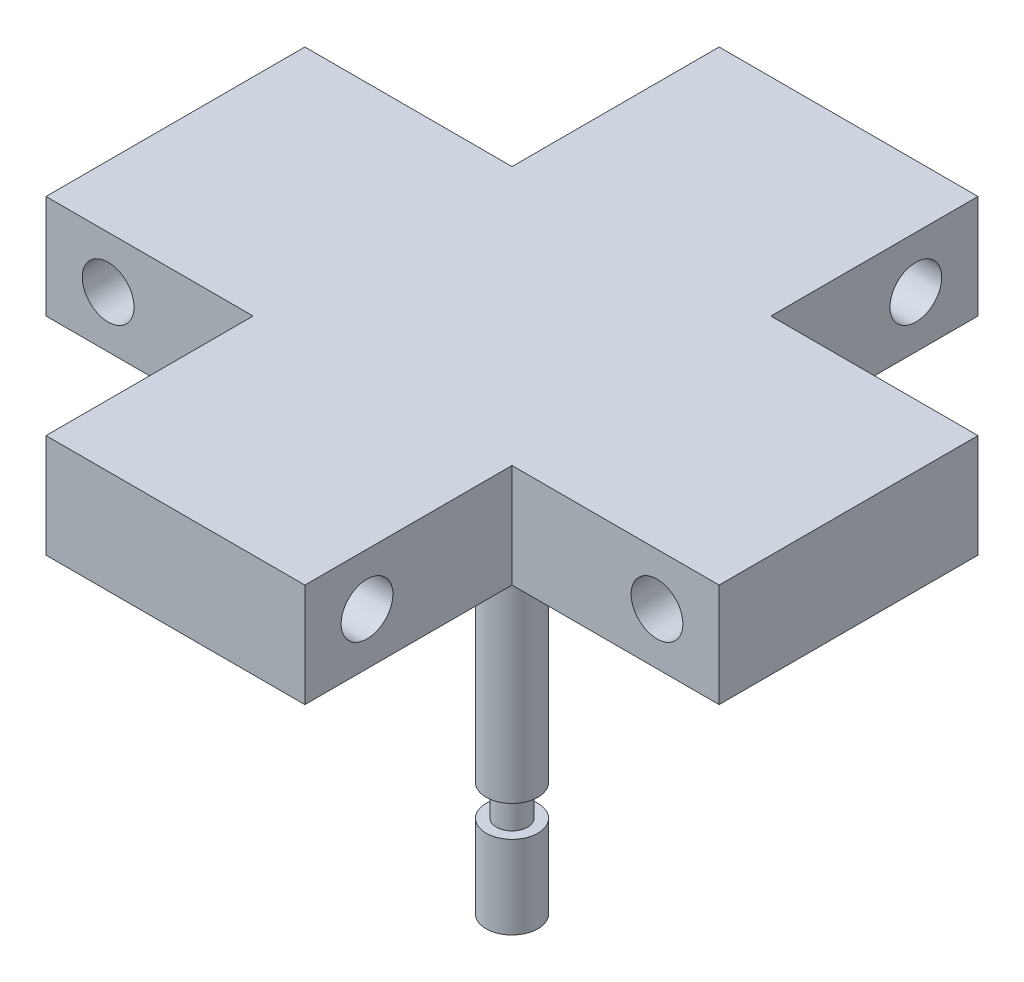
ISO-10303-21;
HEADER;
FILE_DESCRIPTION(('STEP AP214'),'2;1');
FILE_NAME('part.step','',(''),(''),'','','');
FILE_SCHEMA(('AUTOMOTIVE_DESIGN { 1 0 10303 214 1 1 1 1 }'));
ENDSEC;
DATA;
#1=APPLICATION_CONTEXT('core data for automotive mechanical design processes');
#2=APPLICATION_PROTOCOL_DEFINITION('international standard','automotive_design',2000,#1);
#3=PRODUCT_CONTEXT('',#1,'mechanical');
#4=PRODUCT('Part','Part','',(#3));
#5=PRODUCT_RELATED_PRODUCT_CATEGORY('part','',(#4));
#6=PRODUCT_DEFINITION_FORMATION('','',#4);
#7=PRODUCT_DEFINITION_CONTEXT('part definition',#1,'design');
#8=PRODUCT_DEFINITION('design','',#6,#7);
#9=PRODUCT_DEFINITION_SHAPE('','',#8);
#10=(LENGTH_UNIT() NAMED_UNIT(*) SI_UNIT(.MILLI.,.METRE.));
#11=(NAMED_UNIT(*) PLANE_ANGLE_UNIT() SI_UNIT($,.RADIAN.));
#12=(NAMED_UNIT(*) SI_UNIT($,.STERADIAN.) SOLID_ANGLE_UNIT());
#13=UNCERTAINTY_MEASURE_WITH_UNIT(LENGTH_MEASURE(1.E-05),#10,'distance_accuracy_value','');
#14=(GEOMETRIC_REPRESENTATION_CONTEXT(3) GLOBAL_UNCERTAINTY_ASSIGNED_CONTEXT((#13)) GLOBAL_UNIT_ASSIGNED_CONTEXT((#10,
#11,#12)) REPRESENTATION_CONTEXT('',''));
#15=CARTESIAN_POINT('',(0.,0.,0.));
#16=DIRECTION('',(0.,0.,1.));
#17=DIRECTION('',(1.,0.,0.));
#18=AXIS2_PLACEMENT_3D('',#15,#16,#17);
#19=CARTESIAN_POINT('',(0.,-40.,0.));
#20=DIRECTION('',(0.,1.,0.));
#21=DIRECTION('',(0.,0.,1.));
#22=AXIS2_PLACEMENT_3D('',#19,#20,#21);
#23=CYLINDRICAL_SURFACE('',#22,2.5);
#24=CARTESIAN_POINT('',(0.,0.,0.));
#25=DIRECTION('',(0.,1.,0.));
#26=DIRECTION('',(0.,0.,1.));
#27=AXIS2_PLACEMENT_3D('',#24,#25,#26);
#28=CIRCLE('',#27,2.5);
#29=CARTESIAN_POINT('',(0.,0.,2.5));
#30=VERTEX_POINT('',#29);
#31=EDGE_CURVE('E301',#30,#30,#28,.T.);
#32=ORIENTED_EDGE('',*,*,#31,.F.);
#33=EDGE_LOOP('',(#32));
#34=FACE_BOUND('',#33,.T.);
#35=CARTESIAN_POINT('',(0.,-29.,0.));
#36=DIRECTION('',(0.,1.,0.));
#37=DIRECTION('',(0.,0.,1.));
#38=AXIS2_PLACEMENT_3D('',#35,#36,#37);
#39=CIRCLE('',#38,2.5);
#40=CARTESIAN_POINT('',(0.,-29.,2.5));
#41=VERTEX_POINT('',#40);
#42=EDGE_CURVE('E298',#41,#41,#39,.T.);
#43=ORIENTED_EDGE('',*,*,#42,.T.);
#44=EDGE_LOOP('',(#43));
#45=FACE_BOUND('',#44,.T.);
#46=ADVANCED_FACE('F35',(#34,#45),#23,.T.);
#47=CARTESIAN_POINT('',(0.,10.,-12.5));
#48=DIRECTION('',(0.,0.,1.));
#49=DIRECTION('',(1.,0.,0.));
#50=AXIS2_PLACEMENT_3D('',#47,#48,#49);
#51=PLANE('',#50);
#52=CARTESIAN_POINT('',(-26.5000000000001,4.99999999999999,-12.5));
#53=DIRECTION('',(0.,0.,1.));
#54=DIRECTION('',(1.,0.,0.));
#55=AXIS2_PLACEMENT_3D('',#52,#53,#54);
#56=CIRCLE('',#55,2.49999999999999);
#57=CARTESIAN_POINT('',(-24.0000000000001,4.99999999999999,-12.5));
#58=VERTEX_POINT('',#57);
#59=EDGE_CURVE('E307',#58,#58,#56,.T.);
#60=ORIENTED_EDGE('',*,*,#59,.T.);
#61=EDGE_LOOP('',(#60));
#62=FACE_BOUND('',#61,.T.);
#63=DIRECTION('',(-1.,0.,0.));
#64=VECTOR('',#63,1.);
#65=CARTESIAN_POINT('',(0.,0.,-12.5));
#66=LINE('',#65,#64);
#67=CARTESIAN_POINT('',(-12.5,0.,-12.5));
#68=VERTEX_POINT('',#67);
#69=CARTESIAN_POINT('',(-32.5,0.,-12.5));
#70=VERTEX_POINT('',#69);
#71=EDGE_CURVE('E159',#68,#70,#66,.T.);
#72=ORIENTED_EDGE('',*,*,#71,.T.);
#73=DIRECTION('',(0.,-1.,0.));
#74=VECTOR('',#73,1.);
#75=CARTESIAN_POINT('',(-32.5,10.,-12.5));
#76=LINE('',#75,#74);
#77=CARTESIAN_POINT('',(-32.5,10.,-12.5));
#78=VERTEX_POINT('',#77);
#79=EDGE_CURVE('E11',#78,#70,#76,.T.);
#80=ORIENTED_EDGE('',*,*,#79,.F.);
#81=DIRECTION('',(-1.,0.,0.));
#82=VECTOR('',#81,1.);
#83=CARTESIAN_POINT('',(0.,10.,-12.5));
#84=LINE('',#83,#82);
#85=CARTESIAN_POINT('',(-12.5,10.,-12.5));
#86=VERTEX_POINT('',#85);
#87=EDGE_CURVE('E192',#86,#78,#84,.T.);
#88=ORIENTED_EDGE('',*,*,#87,.F.);
#89=DIRECTION('',(0.,-1.,0.));
#90=VECTOR('',#89,1.);
#91=CARTESIAN_POINT('',(-12.5,10.,-12.5));
#92=LINE('',#91,#90);
#93=EDGE_CURVE('E54',#86,#68,#92,.T.);
#94=ORIENTED_EDGE('',*,*,#93,.T.);
#95=EDGE_LOOP('',(#72,#80,#88,#94));
#96=FACE_BOUND('',#95,.T.);
#97=ADVANCED_FACE('F37',(#62,#96),#51,.F.);
#98=CARTESIAN_POINT('',(-32.5,10.,0.));
#99=DIRECTION('',(1.,0.,0.));
#100=DIRECTION('',(0.,0.,-1.));
#101=AXIS2_PLACEMENT_3D('',#98,#99,#100);
#102=PLANE('',#101);
#103=DIRECTION('',(0.,0.,1.));
#104=VECTOR('',#103,1.);
#105=CARTESIAN_POINT('',(-32.5,0.,0.));
#106=LINE('',#105,#104);
#107=CARTESIAN_POINT('',(-32.5,0.,12.5));
#108=VERTEX_POINT('',#107);
#109=EDGE_CURVE('E161',#70,#108,#106,.T.);
#110=ORIENTED_EDGE('',*,*,#109,.T.);
#111=DIRECTION('',(0.,-1.,0.));
#112=VECTOR('',#111,1.);
#113=CARTESIAN_POINT('',(-32.5,10.,12.5));
#114=LINE('',#113,#112);
#115=CARTESIAN_POINT('',(-32.5,10.,12.5));
#116=VERTEX_POINT('',#115);
#117=EDGE_CURVE('E45',#116,#108,#114,.T.);
#118=ORIENTED_EDGE('',*,*,#117,.F.);
#119=DIRECTION('',(0.,0.,1.));
#120=VECTOR('',#119,1.);
#121=CARTESIAN_POINT('',(-32.5,10.,0.));
#122=LINE('',#121,#120);
#123=EDGE_CURVE('E104',#78,#116,#122,.T.);
#124=ORIENTED_EDGE('',*,*,#123,.F.);
#125=ORIENTED_EDGE('',*,*,#79,.T.);
#126=EDGE_LOOP('',(#110,#118,#124,#125));
#127=FACE_BOUND('',#126,.T.);
#128=ADVANCED_FACE('F268',(#127),#102,.F.);
#129=CARTESIAN_POINT('',(0.,10.,12.5));
#130=DIRECTION('',(0.,0.,1.));
#131=DIRECTION('',(1.,0.,0.));
#132=AXIS2_PLACEMENT_3D('',#129,#130,#131);
#133=PLANE('',#132);
#134=CARTESIAN_POINT('',(-26.5000000000001,4.99999999999999,12.5));
#135=DIRECTION('',(0.,0.,1.));
#136=DIRECTION('',(1.,0.,0.));
#137=AXIS2_PLACEMENT_3D('',#134,#135,#136);
#138=CIRCLE('',#137,2.49999999999999);
#139=CARTESIAN_POINT('',(-24.0000000000001,4.99999999999999,12.5));
#140=VERTEX_POINT('',#139);
#141=EDGE_CURVE('E303',#140,#140,#138,.T.);
#142=ORIENTED_EDGE('',*,*,#141,.F.);
#143=EDGE_LOOP('',(#142));
#144=FACE_BOUND('',#143,.T.);
#145=DIRECTION('',(-1.,0.,0.));
#146=VECTOR('',#145,1.);
#147=CARTESIAN_POINT('',(0.,0.,12.5));
#148=LINE('',#147,#146);
#149=CARTESIAN_POINT('',(-12.5,0.,12.5));
#150=VERTEX_POINT('',#149);
#151=EDGE_CURVE('E165',#150,#108,#148,.T.);
#152=ORIENTED_EDGE('',*,*,#151,.F.);
#153=DIRECTION('',(0.,-1.,0.));
#154=VECTOR('',#153,1.);
#155=CARTESIAN_POINT('',(-12.5,10.,12.5));
#156=LINE('',#155,#154);
#157=CARTESIAN_POINT('',(-12.5,10.,12.5));
#158=VERTEX_POINT('',#157);
#159=EDGE_CURVE('E206',#158,#150,#156,.T.);
#160=ORIENTED_EDGE('',*,*,#159,.F.);
#161=DIRECTION('',(-1.,0.,0.));
#162=VECTOR('',#161,1.);
#163=CARTESIAN_POINT('',(0.,10.,12.5));
#164=LINE('',#163,#162);
#165=EDGE_CURVE('E229',#158,#116,#164,.T.);
#166=ORIENTED_EDGE('',*,*,#165,.T.);
#167=ORIENTED_EDGE('',*,*,#117,.T.);
#168=EDGE_LOOP('',(#152,#160,#166,#167));
#169=FACE_BOUND('',#168,.T.);
#170=ADVANCED_FACE('F340',(#144,#169),#133,.T.);
#171=CARTESIAN_POINT('',(-12.5,10.,0.));
#172=DIRECTION('',(1.,0.,0.));
#173=DIRECTION('',(0.,0.,-1.));
#174=AXIS2_PLACEMENT_3D('',#171,#172,#173);
#175=PLANE('',#174);
#176=CARTESIAN_POINT('',(-12.5,4.99999999995049,26.4999999987264));
#177=DIRECTION('',(1.,0.,0.));
#178=DIRECTION('',(0.,0.,-1.));
#179=AXIS2_PLACEMENT_3D('',#176,#177,#178);
#180=CIRCLE('',#179,2.5);
#181=CARTESIAN_POINT('',(-12.5,4.99999999995049,23.9999999987264));
#182=VERTEX_POINT('',#181);
#183=EDGE_CURVE('E162',#182,#182,#180,.T.);
#184=ORIENTED_EDGE('',*,*,#183,.T.);
#185=EDGE_LOOP('',(#184));
#186=FACE_BOUND('',#185,.T.);
#187=DIRECTION('',(0.,0.,1.));
#188=VECTOR('',#187,1.);
#189=CARTESIAN_POINT('',(-12.5,0.,0.));
#190=LINE('',#189,#188);
#191=CARTESIAN_POINT('',(-12.5,0.,32.5));
#192=VERTEX_POINT('',#191);
#193=EDGE_CURVE('E168',#150,#192,#190,.T.);
#194=ORIENTED_EDGE('',*,*,#193,.T.);
#195=DIRECTION('',(0.,-1.,0.));
#196=VECTOR('',#195,1.);
#197=CARTESIAN_POINT('',(-12.5,10.,32.5));
#198=LINE('',#197,#196);
#199=CARTESIAN_POINT('',(-12.5,10.,32.5));
#200=VERTEX_POINT('',#199);
#201=EDGE_CURVE('E204',#200,#192,#198,.T.);
#202=ORIENTED_EDGE('',*,*,#201,.F.);
#203=DIRECTION('',(0.,0.,1.));
#204=VECTOR('',#203,1.);
#205=CARTESIAN_POINT('',(-12.5,10.,0.));
#206=LINE('',#205,#204);
#207=EDGE_CURVE('E232',#158,#200,#206,.T.);
#208=ORIENTED_EDGE('',*,*,#207,.F.);
#209=ORIENTED_EDGE('',*,*,#159,.T.);
#210=EDGE_LOOP('',(#194,#202,#208,#209));
#211=FACE_BOUND('',#210,.T.);
#212=ADVANCED_FACE('F337',(#186,#211),#175,.F.);
#213=CARTESIAN_POINT('',(0.,10.,32.5));
#214=DIRECTION('',(0.,0.,1.));
#215=DIRECTION('',(1.,0.,0.));
#216=AXIS2_PLACEMENT_3D('',#213,#214,#215);
#217=PLANE('',#216);
#218=DIRECTION('',(-1.,0.,0.));
#219=VECTOR('',#218,1.);
#220=CARTESIAN_POINT('',(0.,0.,32.5));
#221=LINE('',#220,#219);
#222=CARTESIAN_POINT('',(12.5,0.,32.5));
#223=VERTEX_POINT('',#222);
#224=EDGE_CURVE('E171',#223,#192,#221,.T.);
#225=ORIENTED_EDGE('',*,*,#224,.F.);
#226=DIRECTION('',(0.,-1.,0.));
#227=VECTOR('',#226,1.);
#228=CARTESIAN_POINT('',(12.5,10.,32.5));
#229=LINE('',#228,#227);
#230=CARTESIAN_POINT('',(12.5,10.,32.5));
#231=VERTEX_POINT('',#230);
#232=EDGE_CURVE('E202',#231,#223,#229,.T.);
#233=ORIENTED_EDGE('',*,*,#232,.F.);
#234=DIRECTION('',(-1.,0.,0.));
#235=VECTOR('',#234,1.);
#236=CARTESIAN_POINT('',(0.,10.,32.5));
#237=LINE('',#236,#235);
#238=EDGE_CURVE('E234',#231,#200,#237,.T.);
#239=ORIENTED_EDGE('',*,*,#238,.T.);
#240=ORIENTED_EDGE('',*,*,#201,.T.);
#241=EDGE_LOOP('',(#225,#233,#239,#240));
#242=FACE_BOUND('',#241,.T.);
#243=ADVANCED_FACE('F333',(#242),#217,.T.);
#244=CARTESIAN_POINT('',(12.5,10.,0.));
#245=DIRECTION('',(1.,0.,0.));
#246=DIRECTION('',(0.,0.,-1.));
#247=AXIS2_PLACEMENT_3D('',#244,#245,#246);
#248=PLANE('',#247);
#249=CARTESIAN_POINT('',(12.5,4.99999999995049,26.4999999987264));
#250=DIRECTION('',(1.,0.,0.));
#251=DIRECTION('',(0.,0.,-1.));
#252=AXIS2_PLACEMENT_3D('',#249,#250,#251);
#253=CIRCLE('',#252,2.5);
#254=CARTESIAN_POINT('',(12.5,4.99999999995049,23.9999999987264));
#255=VERTEX_POINT('',#254);
#256=EDGE_CURVE('E210',#255,#255,#253,.T.);
#257=ORIENTED_EDGE('',*,*,#256,.F.);
#258=EDGE_LOOP('',(#257));
#259=FACE_BOUND('',#258,.T.);
#260=DIRECTION('',(0.,0.,1.));
#261=VECTOR('',#260,1.);
#262=CARTESIAN_POINT('',(12.5,0.,0.));
#263=LINE('',#262,#261);
#264=CARTESIAN_POINT('',(12.5,0.,12.5));
#265=VERTEX_POINT('',#264);
#266=EDGE_CURVE('E174',#265,#223,#263,.T.);
#267=ORIENTED_EDGE('',*,*,#266,.F.);
#268=DIRECTION('',(0.,-1.,0.));
#269=VECTOR('',#268,1.);
#270=CARTESIAN_POINT('',(12.5,10.,12.5));
#271=LINE('',#270,#269);
#272=CARTESIAN_POINT('',(12.5,10.,12.5));
#273=VERTEX_POINT('',#272);
#274=EDGE_CURVE('E200',#273,#265,#271,.T.);
#275=ORIENTED_EDGE('',*,*,#274,.F.);
#276=DIRECTION('',(0.,0.,1.));
#277=VECTOR('',#276,1.);
#278=CARTESIAN_POINT('',(12.5,10.,0.));
#279=LINE('',#278,#277);
#280=EDGE_CURVE('E237',#273,#231,#279,.T.);
#281=ORIENTED_EDGE('',*,*,#280,.T.);
#282=ORIENTED_EDGE('',*,*,#232,.T.);
#283=EDGE_LOOP('',(#267,#275,#281,#282));
#284=FACE_BOUND('',#283,.T.);
#285=ADVANCED_FACE('F319',(#259,#284),#248,.T.);
#286=CARTESIAN_POINT('',(0.,10.,12.5));
#287=DIRECTION('',(0.,0.,-1.));
#288=DIRECTION('',(-1.,0.,0.));
#289=AXIS2_PLACEMENT_3D('',#286,#287,#288);
#290=PLANE('',#289);
#291=CARTESIAN_POINT('',(26.4999999999999,4.99999999999999,12.5));
#292=DIRECTION('',(0.,0.,1.));
#293=DIRECTION('',(1.,0.,0.));
#294=AXIS2_PLACEMENT_3D('',#291,#292,#293);
#295=CIRCLE('',#294,2.49999999999999);
#296=CARTESIAN_POINT('',(28.9999999999999,4.99999999999999,12.5));
#297=VERTEX_POINT('',#296);
#298=EDGE_CURVE('E221',#297,#297,#295,.T.);
#299=ORIENTED_EDGE('',*,*,#298,.F.);
#300=EDGE_LOOP('',(#299));
#301=FACE_BOUND('',#300,.T.);
#302=DIRECTION('',(1.,0.,0.));
#303=VECTOR('',#302,1.);
#304=CARTESIAN_POINT('',(0.,0.,12.5));
#305=LINE('',#304,#303);
#306=CARTESIAN_POINT('',(32.5,0.,12.5));
#307=VERTEX_POINT('',#306);
#308=EDGE_CURVE('E177',#265,#307,#305,.T.);
#309=ORIENTED_EDGE('',*,*,#308,.T.);
#310=DIRECTION('',(0.,-1.,0.));
#311=VECTOR('',#310,1.);
#312=CARTESIAN_POINT('',(32.5,10.,12.5));
#313=LINE('',#312,#311);
#314=CARTESIAN_POINT('',(32.5,10.,12.5));
#315=VERTEX_POINT('',#314);
#316=EDGE_CURVE('E198',#315,#307,#313,.T.);
#317=ORIENTED_EDGE('',*,*,#316,.F.);
#318=DIRECTION('',(1.,0.,0.));
#319=VECTOR('',#318,1.);
#320=CARTESIAN_POINT('',(0.,10.,12.5));
#321=LINE('',#320,#319);
#322=EDGE_CURVE('E240',#273,#315,#321,.T.);
#323=ORIENTED_EDGE('',*,*,#322,.F.);
#324=ORIENTED_EDGE('',*,*,#274,.T.);
#325=EDGE_LOOP('',(#309,#317,#323,#324));
#326=FACE_BOUND('',#325,.T.);
#327=ADVANCED_FACE('F315',(#301,#326),#290,.F.);
#328=CARTESIAN_POINT('',(32.5,10.,0.));
#329=DIRECTION('',(1.,0.,0.));
#330=DIRECTION('',(0.,0.,-1.));
#331=AXIS2_PLACEMENT_3D('',#328,#329,#330);
#332=PLANE('',#331);
#333=DIRECTION('',(0.,0.,1.));
#334=VECTOR('',#333,1.);
#335=CARTESIAN_POINT('',(32.5,0.,0.));
#336=LINE('',#335,#334);
#337=CARTESIAN_POINT('',(32.5,0.,-12.5));
#338=VERTEX_POINT('',#337);
#339=EDGE_CURVE('E180',#338,#307,#336,.T.);
#340=ORIENTED_EDGE('',*,*,#339,.F.);
#341=DIRECTION('',(0.,-1.,0.));
#342=VECTOR('',#341,1.);
#343=CARTESIAN_POINT('',(32.5,10.,-12.5));
#344=LINE('',#343,#342);
#345=CARTESIAN_POINT('',(32.5,10.,-12.5));
#346=VERTEX_POINT('',#345);
#347=EDGE_CURVE('E196',#346,#338,#344,.T.);
#348=ORIENTED_EDGE('',*,*,#347,.F.);
#349=DIRECTION('',(0.,0.,1.));
#350=VECTOR('',#349,1.);
#351=CARTESIAN_POINT('',(32.5,10.,0.));
#352=LINE('',#351,#350);
#353=EDGE_CURVE('E242',#346,#315,#352,.T.);
#354=ORIENTED_EDGE('',*,*,#353,.T.);
#355=ORIENTED_EDGE('',*,*,#316,.T.);
#356=EDGE_LOOP('',(#340,#348,#354,#355));
#357=FACE_BOUND('',#356,.T.);
#358=ADVANCED_FACE('F318',(#357),#332,.T.);
#359=CARTESIAN_POINT('',(0.,10.,-12.5));
#360=DIRECTION('',(0.,0.,-1.));
#361=DIRECTION('',(-1.,0.,0.));
#362=AXIS2_PLACEMENT_3D('',#359,#360,#361);
#363=PLANE('',#362);
#364=CARTESIAN_POINT('',(26.4999999999999,4.99999999999999,-12.5));
#365=DIRECTION('',(0.,0.,-1.));
#366=DIRECTION('',(-1.,0.,0.));
#367=AXIS2_PLACEMENT_3D('',#364,#365,#366);
#368=CIRCLE('',#367,2.49999999999999);
#369=CARTESIAN_POINT('',(28.9999999999999,4.99999999999999,-12.5));
#370=VERTEX_POINT('',#369);
#371=EDGE_CURVE('E39',#370,#370,#368,.T.);
#372=ORIENTED_EDGE('',*,*,#371,.F.);
#373=EDGE_LOOP('',(#372));
#374=FACE_BOUND('',#373,.T.);
#375=DIRECTION('',(1.,0.,0.));
#376=VECTOR('',#375,1.);
#377=CARTESIAN_POINT('',(0.,0.,-12.5));
#378=LINE('',#377,#376);
#379=CARTESIAN_POINT('',(12.5,0.,-12.5));
#380=VERTEX_POINT('',#379);
#381=EDGE_CURVE('E183',#380,#338,#378,.T.);
#382=ORIENTED_EDGE('',*,*,#381,.F.);
#383=DIRECTION('',(0.,-1.,0.));
#384=VECTOR('',#383,1.);
#385=CARTESIAN_POINT('',(12.5,10.,-12.5));
#386=LINE('',#385,#384);
#387=CARTESIAN_POINT('',(12.5,10.,-12.5));
#388=VERTEX_POINT('',#387);
#389=EDGE_CURVE('E151',#388,#380,#386,.T.);
#390=ORIENTED_EDGE('',*,*,#389,.F.);
#391=DIRECTION('',(1.,0.,0.));
#392=VECTOR('',#391,1.);
#393=CARTESIAN_POINT('',(0.,10.,-12.5));
#394=LINE('',#393,#392);
#395=EDGE_CURVE('E141',#388,#346,#394,.T.);
#396=ORIENTED_EDGE('',*,*,#395,.T.);
#397=ORIENTED_EDGE('',*,*,#347,.T.);
#398=EDGE_LOOP('',(#382,#390,#396,#397));
#399=FACE_BOUND('',#398,.T.);
#400=ADVANCED_FACE('F246',(#374,#399),#363,.T.);
#401=CARTESIAN_POINT('',(12.5,10.,0.));
#402=DIRECTION('',(-1.,0.,0.));
#403=DIRECTION('',(0.,0.,1.));
#404=AXIS2_PLACEMENT_3D('',#401,#402,#403);
#405=PLANE('',#404);
#406=CARTESIAN_POINT('',(12.5,4.99999999995053,-26.499999998726));
#407=DIRECTION('',(1.,0.,0.));
#408=DIRECTION('',(0.,0.,-1.));
#409=AXIS2_PLACEMENT_3D('',#406,#407,#408);
#410=CIRCLE('',#409,2.49999999999999);
#411=CARTESIAN_POINT('',(12.5,4.99999999995053,-28.999999998726));
#412=VERTEX_POINT('',#411);
#413=EDGE_CURVE('E211',#412,#412,#410,.T.);
#414=ORIENTED_EDGE('',*,*,#413,.F.);
#415=EDGE_LOOP('',(#414));
#416=FACE_BOUND('',#415,.T.);
#417=DIRECTION('',(0.,0.,-1.));
#418=VECTOR('',#417,1.);
#419=CARTESIAN_POINT('',(12.5,0.,0.));
#420=LINE('',#419,#418);
#421=CARTESIAN_POINT('',(12.5,0.,-32.5));
#422=VERTEX_POINT('',#421);
#423=EDGE_CURVE('E148',#380,#422,#420,.T.);
#424=ORIENTED_EDGE('',*,*,#423,.T.);
#425=DIRECTION('',(0.,-1.,0.));
#426=VECTOR('',#425,1.);
#427=CARTESIAN_POINT('',(12.5,10.,-32.5));
#428=LINE('',#427,#426);
#429=CARTESIAN_POINT('',(12.5,10.,-32.5));
#430=VERTEX_POINT('',#429);
#431=EDGE_CURVE('E145',#430,#422,#428,.T.);
#432=ORIENTED_EDGE('',*,*,#431,.F.);
#433=DIRECTION('',(0.,0.,-1.));
#434=VECTOR('',#433,1.);
#435=CARTESIAN_POINT('',(12.5,10.,0.));
#436=LINE('',#435,#434);
#437=EDGE_CURVE('E133',#388,#430,#436,.T.);
#438=ORIENTED_EDGE('',*,*,#437,.F.);
#439=ORIENTED_EDGE('',*,*,#389,.T.);
#440=EDGE_LOOP('',(#424,#432,#438,#439));
#441=FACE_BOUND('',#440,.T.);
#442=ADVANCED_FACE('F146',(#416,#441),#405,.F.);
#443=CARTESIAN_POINT('',(0.,10.,-32.5));
#444=DIRECTION('',(0.,0.,-1.));
#445=DIRECTION('',(-1.,0.,0.));
#446=AXIS2_PLACEMENT_3D('',#443,#444,#445);
#447=PLANE('',#446);
#448=DIRECTION('',(1.,0.,0.));
#449=VECTOR('',#448,1.);
#450=CARTESIAN_POINT('',(0.,0.,-32.5));
#451=LINE('',#450,#449);
#452=CARTESIAN_POINT('',(-12.5,0.,-32.5));
#453=VERTEX_POINT('',#452);
#454=EDGE_CURVE('E187',#453,#422,#451,.T.);
#455=ORIENTED_EDGE('',*,*,#454,.F.);
#456=DIRECTION('',(0.,-1.,0.));
#457=VECTOR('',#456,1.);
#458=CARTESIAN_POINT('',(-12.5,10.,-32.5));
#459=LINE('',#458,#457);
#460=CARTESIAN_POINT('',(-12.5,10.,-32.5));
#461=VERTEX_POINT('',#460);
#462=EDGE_CURVE('E92',#461,#453,#459,.T.);
#463=ORIENTED_EDGE('',*,*,#462,.F.);
#464=DIRECTION('',(1.,0.,0.));
#465=VECTOR('',#464,1.);
#466=CARTESIAN_POINT('',(0.,10.,-32.5));
#467=LINE('',#466,#465);
#468=EDGE_CURVE('E138',#461,#430,#467,.T.);
#469=ORIENTED_EDGE('',*,*,#468,.T.);
#470=ORIENTED_EDGE('',*,*,#431,.T.);
#471=EDGE_LOOP('',(#455,#463,#469,#470));
#472=FACE_BOUND('',#471,.T.);
#473=ADVANCED_FACE('F153',(#472),#447,.T.);
#474=CARTESIAN_POINT('',(-12.5,10.,0.));
#475=DIRECTION('',(-1.,0.,0.));
#476=DIRECTION('',(0.,0.,1.));
#477=AXIS2_PLACEMENT_3D('',#474,#475,#476);
#478=PLANE('',#477);
#479=CARTESIAN_POINT('',(-12.5,4.99999999995053,-26.499999998726));
#480=DIRECTION('',(-1.,0.,0.));
#481=DIRECTION('',(0.,0.,1.));
#482=AXIS2_PLACEMENT_3D('',#479,#480,#481);
#483=CIRCLE('',#482,2.49999999999999);
#484=CARTESIAN_POINT('',(-12.5,4.99999999995053,-28.999999998726));
#485=VERTEX_POINT('',#484);
#486=EDGE_CURVE('E208',#485,#485,#483,.T.);
#487=ORIENTED_EDGE('',*,*,#486,.F.);
#488=EDGE_LOOP('',(#487));
#489=FACE_BOUND('',#488,.T.);
#490=DIRECTION('',(0.,0.,-1.));
#491=VECTOR('',#490,1.);
#492=CARTESIAN_POINT('',(-12.5,0.,0.));
#493=LINE('',#492,#491);
#494=EDGE_CURVE('E189',#68,#453,#493,.T.);
#495=ORIENTED_EDGE('',*,*,#494,.F.);
#496=ORIENTED_EDGE('',*,*,#93,.F.);
#497=DIRECTION('',(0.,0.,-1.));
#498=VECTOR('',#497,1.);
#499=CARTESIAN_POINT('',(-12.5,10.,0.));
#500=LINE('',#499,#498);
#501=EDGE_CURVE('E154',#86,#461,#500,.T.);
#502=ORIENTED_EDGE('',*,*,#501,.T.);
#503=ORIENTED_EDGE('',*,*,#462,.T.);
#504=EDGE_LOOP('',(#495,#496,#502,#503));
#505=FACE_BOUND('',#504,.T.);
#506=ADVANCED_FACE('F250',(#489,#505),#478,.T.);
#507=CARTESIAN_POINT('',(0.,10.,0.));
#508=DIRECTION('',(0.,1.,0.));
#509=DIRECTION('',(0.,0.,1.));
#510=AXIS2_PLACEMENT_3D('',#507,#508,#509);
#511=PLANE('',#510);
#512=ORIENTED_EDGE('',*,*,#87,.T.);
#513=ORIENTED_EDGE('',*,*,#123,.T.);
#514=ORIENTED_EDGE('',*,*,#165,.F.);
#515=ORIENTED_EDGE('',*,*,#207,.T.);
#516=ORIENTED_EDGE('',*,*,#238,.F.);
#517=ORIENTED_EDGE('',*,*,#280,.F.);
#518=ORIENTED_EDGE('',*,*,#322,.T.);
#519=ORIENTED_EDGE('',*,*,#353,.F.);
#520=ORIENTED_EDGE('',*,*,#395,.F.);
#521=ORIENTED_EDGE('',*,*,#437,.T.);
#522=ORIENTED_EDGE('',*,*,#468,.F.);
#523=ORIENTED_EDGE('',*,*,#501,.F.);
#524=EDGE_LOOP('',(#512,#513,#514,#515,#516,#517,#518,#519,#520,#521,#522,#523));
#525=FACE_BOUND('',#524,.T.);
#526=ADVANCED_FACE('F135',(#525),#511,.T.);
#527=CARTESIAN_POINT('',(0.,0.,0.));
#528=DIRECTION('',(0.,1.,0.));
#529=DIRECTION('',(0.,0.,1.));
#530=AXIS2_PLACEMENT_3D('',#527,#528,#529);
#531=PLANE('',#530);
#532=ORIENTED_EDGE('',*,*,#31,.T.);
#533=EDGE_LOOP('',(#532));
#534=FACE_BOUND('',#533,.T.);
#535=ORIENTED_EDGE('',*,*,#71,.F.);
#536=ORIENTED_EDGE('',*,*,#494,.T.);
#537=ORIENTED_EDGE('',*,*,#454,.T.);
#538=ORIENTED_EDGE('',*,*,#423,.F.);
#539=ORIENTED_EDGE('',*,*,#381,.T.);
#540=ORIENTED_EDGE('',*,*,#339,.T.);
#541=ORIENTED_EDGE('',*,*,#308,.F.);
#542=ORIENTED_EDGE('',*,*,#266,.T.);
#543=ORIENTED_EDGE('',*,*,#224,.T.);
#544=ORIENTED_EDGE('',*,*,#193,.F.);
#545=ORIENTED_EDGE('',*,*,#151,.T.);
#546=ORIENTED_EDGE('',*,*,#109,.F.);
#547=EDGE_LOOP('',(#535,#536,#537,#538,#539,#540,#541,#542,#543,#544,#545,#546));
#548=FACE_BOUND('',#547,.T.);
#549=ADVANCED_FACE('F249',(#534,#548),#531,.F.);
#550=CARTESIAN_POINT('',(-32.5,4.99999999995049,26.4999999987264));
#551=DIRECTION('',(1.,0.,0.));
#552=DIRECTION('',(0.,0.,-1.));
#553=AXIS2_PLACEMENT_3D('',#550,#551,#552);
#554=CYLINDRICAL_SURFACE('',#553,2.5);
#555=CARTESIAN_POINT('',(12.5,4.99999999995049,23.9999999987264));
#556=CARTESIAN_POINT('',(12.2395833333333,4.99999999995049,23.9999999987264));
#557=CARTESIAN_POINT('',(11.9791666666667,4.99999999995049,23.9999999987264));
#558=CARTESIAN_POINT('',(11.4583333333333,4.99999999995049,23.9999999987264));
#559=CARTESIAN_POINT('',(11.1979166666667,4.99999999995049,23.9999999987264));
#560=CARTESIAN_POINT('',(10.6770833333333,4.99999999995049,23.9999999987264));
#561=CARTESIAN_POINT('',(10.4166666666667,4.99999999995049,23.9999999987264));
#562=CARTESIAN_POINT('',(9.89583333333334,4.99999999995049,23.9999999987264));
#563=CARTESIAN_POINT('',(9.63541666666667,4.99999999995049,23.9999999987264));
#564=CARTESIAN_POINT('',(9.11458333333334,4.99999999995049,23.9999999987264));
#565=CARTESIAN_POINT('',(8.85416666666667,4.99999999995049,23.9999999987264));
#566=CARTESIAN_POINT('',(8.33333333333334,4.99999999995049,23.9999999987264));
#567=CARTESIAN_POINT('',(8.07291666666667,4.99999999995049,23.9999999987264));
#568=CARTESIAN_POINT('',(7.55208333333333,4.99999999995049,23.9999999987264));
#569=CARTESIAN_POINT('',(7.29166666666667,4.99999999995049,23.9999999987264));
#570=CARTESIAN_POINT('',(6.77083333333333,4.99999999995049,23.9999999987264));
#571=CARTESIAN_POINT('',(6.51041666666667,4.99999999995049,23.9999999987264));
#572=CARTESIAN_POINT('',(5.98958333333333,4.99999999995049,23.9999999987264));
#573=CARTESIAN_POINT('',(5.72916666666667,4.99999999995049,23.9999999987264));
#574=CARTESIAN_POINT('',(5.20833333333334,4.99999999995049,23.9999999987264));
#575=CARTESIAN_POINT('',(4.94791666666667,4.99999999995049,23.9999999987264));
#576=CARTESIAN_POINT('',(4.42708333333334,4.99999999995049,23.9999999987264));
#577=CARTESIAN_POINT('',(4.16666666666667,4.99999999995049,23.9999999987264));
#578=CARTESIAN_POINT('',(3.64583333333333,4.99999999995049,23.9999999987264));
#579=CARTESIAN_POINT('',(3.38541666666667,4.99999999995049,23.9999999987264));
#580=CARTESIAN_POINT('',(2.86458333333333,4.99999999995049,23.9999999987264));
#581=CARTESIAN_POINT('',(2.60416666666667,4.99999999995049,23.9999999987264));
#582=CARTESIAN_POINT('',(2.08333333333333,4.99999999995049,23.9999999987264));
#583=CARTESIAN_POINT('',(1.82291666666667,4.99999999995049,23.9999999987264));
#584=CARTESIAN_POINT('',(1.30208333333334,4.99999999995049,23.9999999987264));
#585=CARTESIAN_POINT('',(1.04166666666667,4.99999999995049,23.9999999987264));
#586=CARTESIAN_POINT('',(0.520833333333336,4.99999999995049,23.9999999987264));
#587=CARTESIAN_POINT('',(0.260416666666668,4.99999999995049,23.9999999987264));
#588=CARTESIAN_POINT('',(-0.260416666666668,4.99999999995049,23.9999999987264));
#589=CARTESIAN_POINT('',(-0.520833333333336,4.99999999995049,23.9999999987264));
#590=CARTESIAN_POINT('',(-1.04166666666667,4.99999999995049,23.9999999987264));
#591=CARTESIAN_POINT('',(-1.30208333333333,4.99999999995049,23.9999999987264));
#592=CARTESIAN_POINT('',(-1.82291666666666,4.99999999995049,23.9999999987264));
#593=CARTESIAN_POINT('',(-2.08333333333333,4.99999999995049,23.9999999987264));
#594=CARTESIAN_POINT('',(-2.60416666666666,4.99999999995049,23.9999999987264));
#595=CARTESIAN_POINT('',(-2.86458333333333,4.99999999995049,23.9999999987264));
#596=CARTESIAN_POINT('',(-3.38541666666667,4.99999999995049,23.9999999987264));
#597=CARTESIAN_POINT('',(-3.64583333333333,4.99999999995049,23.9999999987264));
#598=CARTESIAN_POINT('',(-4.16666666666666,4.99999999995049,23.9999999987264));
#599=CARTESIAN_POINT('',(-4.42708333333333,4.99999999995049,23.9999999987264));
#600=CARTESIAN_POINT('',(-4.94791666666666,4.99999999995049,23.9999999987264));
#601=CARTESIAN_POINT('',(-5.20833333333333,4.99999999995049,23.9999999987264));
#602=CARTESIAN_POINT('',(-5.72916666666666,4.99999999995049,23.9999999987264));
#603=CARTESIAN_POINT('',(-5.98958333333333,4.99999999995049,23.9999999987264));
#604=CARTESIAN_POINT('',(-6.51041666666667,4.99999999995049,23.9999999987264));
#605=CARTESIAN_POINT('',(-6.77083333333333,4.99999999995049,23.9999999987264));
#606=CARTESIAN_POINT('',(-7.29166666666667,4.99999999995049,23.9999999987264));
#607=CARTESIAN_POINT('',(-7.55208333333333,4.99999999995049,23.9999999987264));
#608=CARTESIAN_POINT('',(-8.07291666666667,4.99999999995049,23.9999999987264));
#609=CARTESIAN_POINT('',(-8.33333333333333,4.99999999995049,23.9999999987264));
#610=CARTESIAN_POINT('',(-8.85416666666667,4.99999999995049,23.9999999987264));
#611=CARTESIAN_POINT('',(-9.11458333333333,4.99999999995049,23.9999999987264));
#612=CARTESIAN_POINT('',(-9.63541666666667,4.99999999995049,23.9999999987264));
#613=CARTESIAN_POINT('',(-9.89583333333333,4.99999999995049,23.9999999987264));
#614=CARTESIAN_POINT('',(-10.4166666666667,4.99999999995049,23.9999999987264));
#615=CARTESIAN_POINT('',(-10.6770833333333,4.99999999995049,23.9999999987264));
#616=CARTESIAN_POINT('',(-11.1979166666667,4.99999999995049,23.9999999987264));
#617=CARTESIAN_POINT('',(-11.4583333333333,4.99999999995049,23.9999999987264));
#618=CARTESIAN_POINT('',(-11.9791666666667,4.99999999995049,23.9999999987264));
#619=CARTESIAN_POINT('',(-12.2395833333333,4.99999999995049,23.9999999987264));
#620=CARTESIAN_POINT('',(-12.5,4.99999999995049,23.9999999987264));
#621=B_SPLINE_CURVE_WITH_KNOTS('',3,(#555,#556,#557,#558,#559,#560,#561,#562,#563,#564,#565,
#566,#567,#568,#569,#570,#571,#572,#573,#574,#575,#576,#577,#578,#579,#580,#581,#582,#583,#584,
#585,#586,#587,#588,#589,#590,#591,#592,#593,#594,#595,#596,#597,#598,#599,#600,#601,#602,#603,
#604,#605,#606,#607,#608,#609,#610,#611,#612,#613,#614,#615,#616,#617,#618,#619,#620),
.UNSPECIFIED.,.F.,.F.,(4,2,2,2,2,2,2,2,2,2,2,2,2,2,2,2,2,2,2,2,2,2,2,2,2,2,2,2,2,2,2,2,4),(0.,
0.781249999999997,1.5625,2.34375,3.125,3.90625,4.6875,5.46875,6.25000000000001,7.03125,7.8125,
8.59375,9.375,10.15625,10.9375,11.71875,12.5,13.28125,14.0625,14.84375,15.625,16.40625,17.1875,
17.96875,18.75,19.53125,20.3125,21.09375,21.875,22.65625,23.4375,24.21875,25.),.UNSPECIFIED.);
#622=EDGE_CURVE('BSEAM447',#255,#182,#621,.T.);
#623=ORIENTED_EDGE('',*,*,#256,.T.);
#624=ORIENTED_EDGE('',*,*,#183,.F.);
#625=ORIENTED_EDGE('',*,*,#622,.T.);
#626=ORIENTED_EDGE('',*,*,#622,.F.);
#627=EDGE_LOOP('',(#623,#625,#624,#626));
#628=FACE_BOUND('',#627,.T.);
#629=ADVANCED_FACE('F447',(#628),#554,.F.);
#630=CARTESIAN_POINT('',(-32.5,4.99999999995053,-26.499999998726));
#631=DIRECTION('',(1.,0.,0.));
#632=DIRECTION('',(0.,0.,-1.));
#633=AXIS2_PLACEMENT_3D('',#630,#631,#632);
#634=CYLINDRICAL_SURFACE('',#633,2.49999999999999);
#635=CARTESIAN_POINT('',(-12.5,4.99999999995053,-28.999999998726));
#636=CARTESIAN_POINT('',(-12.2395833333333,4.99999999995053,-28.999999998726));
#637=CARTESIAN_POINT('',(-11.9791666666667,4.99999999995053,-28.999999998726));
#638=CARTESIAN_POINT('',(-11.4583333333333,4.99999999995053,-28.999999998726));
#639=CARTESIAN_POINT('',(-11.1979166666667,4.99999999995053,-28.999999998726));
#640=CARTESIAN_POINT('',(-10.6770833333333,4.99999999995053,-28.999999998726));
#641=CARTESIAN_POINT('',(-10.4166666666667,4.99999999995053,-28.999999998726));
#642=CARTESIAN_POINT('',(-9.89583333333333,4.99999999995053,-28.999999998726));
#643=CARTESIAN_POINT('',(-9.63541666666666,4.99999999995053,-28.999999998726));
#644=CARTESIAN_POINT('',(-9.11458333333333,4.99999999995053,-28.999999998726));
#645=CARTESIAN_POINT('',(-8.85416666666666,4.99999999995053,-28.999999998726));
#646=CARTESIAN_POINT('',(-8.33333333333333,4.99999999995053,-28.999999998726));
#647=CARTESIAN_POINT('',(-8.07291666666666,4.99999999995053,-28.999999998726));
#648=CARTESIAN_POINT('',(-7.55208333333333,4.99999999995053,-28.999999998726));
#649=CARTESIAN_POINT('',(-7.29166666666667,4.99999999995053,-28.999999998726));
#650=CARTESIAN_POINT('',(-6.77083333333333,4.99999999995053,-28.999999998726));
#651=CARTESIAN_POINT('',(-6.51041666666667,4.99999999995053,-28.999999998726));
#652=CARTESIAN_POINT('',(-5.98958333333333,4.99999999995053,-28.999999998726));
#653=CARTESIAN_POINT('',(-5.72916666666666,4.99999999995053,-28.999999998726));
#654=CARTESIAN_POINT('',(-5.20833333333333,4.99999999995053,-28.999999998726));
#655=CARTESIAN_POINT('',(-4.94791666666667,4.99999999995053,-28.999999998726));
#656=CARTESIAN_POINT('',(-4.42708333333333,4.99999999995053,-28.999999998726));
#657=CARTESIAN_POINT('',(-4.16666666666667,4.99999999995053,-28.999999998726));
#658=CARTESIAN_POINT('',(-3.64583333333333,4.99999999995053,-28.999999998726));
#659=CARTESIAN_POINT('',(-3.38541666666667,4.99999999995053,-28.999999998726));
#660=CARTESIAN_POINT('',(-2.86458333333333,4.99999999995053,-28.999999998726));
#661=CARTESIAN_POINT('',(-2.60416666666667,4.99999999995053,-28.999999998726));
#662=CARTESIAN_POINT('',(-2.08333333333334,4.99999999995053,-28.999999998726));
#663=CARTESIAN_POINT('',(-1.82291666666667,4.99999999995053,-28.999999998726));
#664=CARTESIAN_POINT('',(-1.30208333333334,4.99999999995053,-28.999999998726));
#665=CARTESIAN_POINT('',(-1.04166666666667,4.99999999995053,-28.999999998726));
#666=CARTESIAN_POINT('',(-0.520833333333338,4.99999999995053,-28.999999998726));
#667=CARTESIAN_POINT('',(-0.260416666666673,4.99999999995053,-28.999999998726));
#668=CARTESIAN_POINT('',(0.260416666666659,4.99999999995053,-28.999999998726));
#669=CARTESIAN_POINT('',(0.520833333333325,4.99999999995053,-28.999999998726));
#670=CARTESIAN_POINT('',(1.04166666666666,4.99999999995053,-28.999999998726));
#671=CARTESIAN_POINT('',(1.30208333333333,4.99999999995053,-28.999999998726));
#672=CARTESIAN_POINT('',(1.82291666666666,4.99999999995053,-28.999999998726));
#673=CARTESIAN_POINT('',(2.08333333333333,4.99999999995053,-28.999999998726));
#674=CARTESIAN_POINT('',(2.60416666666666,4.99999999995053,-28.999999998726));
#675=CARTESIAN_POINT('',(2.86458333333332,4.99999999995053,-28.999999998726));
#676=CARTESIAN_POINT('',(3.38541666666665,4.99999999995053,-28.999999998726));
#677=CARTESIAN_POINT('',(3.64583333333332,4.99999999995053,-28.999999998726));
#678=CARTESIAN_POINT('',(4.16666666666665,4.99999999995053,-28.999999998726));
#679=CARTESIAN_POINT('',(4.42708333333332,4.99999999995053,-28.999999998726));
#680=CARTESIAN_POINT('',(4.94791666666666,4.99999999995053,-28.999999998726));
#681=CARTESIAN_POINT('',(5.20833333333332,4.99999999995053,-28.999999998726));
#682=CARTESIAN_POINT('',(5.72916666666666,4.99999999995053,-28.999999998726));
#683=CARTESIAN_POINT('',(5.98958333333332,4.99999999995053,-28.999999998726));
#684=CARTESIAN_POINT('',(6.51041666666666,4.99999999995053,-28.999999998726));
#685=CARTESIAN_POINT('',(6.77083333333332,4.99999999995053,-28.999999998726));
#686=CARTESIAN_POINT('',(7.29166666666665,4.99999999995053,-28.999999998726));
#687=CARTESIAN_POINT('',(7.55208333333332,4.99999999995053,-28.999999998726));
#688=CARTESIAN_POINT('',(8.07291666666665,4.99999999995053,-28.999999998726));
#689=CARTESIAN_POINT('',(8.33333333333332,4.99999999995053,-28.999999998726));
#690=CARTESIAN_POINT('',(8.85416666666665,4.99999999995053,-28.999999998726));
#691=CARTESIAN_POINT('',(9.11458333333332,4.99999999995053,-28.999999998726));
#692=CARTESIAN_POINT('',(9.63541666666665,4.99999999995053,-28.999999998726));
#693=CARTESIAN_POINT('',(9.89583333333332,4.99999999995053,-28.999999998726));
#694=CARTESIAN_POINT('',(10.4166666666667,4.99999999995053,-28.999999998726));
#695=CARTESIAN_POINT('',(10.6770833333333,4.99999999995053,-28.999999998726));
#696=CARTESIAN_POINT('',(11.1979166666667,4.99999999995053,-28.999999998726));
#697=CARTESIAN_POINT('',(11.4583333333333,4.99999999995053,-28.999999998726));
#698=CARTESIAN_POINT('',(11.9791666666667,4.99999999995053,-28.999999998726));
#699=CARTESIAN_POINT('',(12.2395833333333,4.99999999995053,-28.999999998726));
#700=CARTESIAN_POINT('',(12.5,4.99999999995053,-28.999999998726));
#701=B_SPLINE_CURVE_WITH_KNOTS('',3,(#635,#636,#637,#638,#639,#640,#641,#642,#643,#644,#645,
#646,#647,#648,#649,#650,#651,#652,#653,#654,#655,#656,#657,#658,#659,#660,#661,#662,#663,#664,
#665,#666,#667,#668,#669,#670,#671,#672,#673,#674,#675,#676,#677,#678,#679,#680,#681,#682,#683,
#684,#685,#686,#687,#688,#689,#690,#691,#692,#693,#694,#695,#696,#697,#698,#699,#700),
.UNSPECIFIED.,.F.,.F.,(4,2,2,2,2,2,2,2,2,2,2,2,2,2,2,2,2,2,2,2,2,2,2,2,2,2,2,2,2,2,2,2,4),(0.,
0.781250000000001,1.5625,2.34375,3.125,3.90625,4.6875,5.46874999999999,6.25,7.03125,
7.81249999999999,8.59374999999999,9.37499999999999,10.15625,10.9375,11.71875,12.5,13.28125,
14.0625,14.84375,15.625,16.40625,17.1875,17.96875,18.75,19.53125,20.3125,21.09375,21.875,
22.65625,23.4375,24.21875,25.),.UNSPECIFIED.);
#702=EDGE_CURVE('BSEAM425',#485,#412,#701,.T.);
#703=ORIENTED_EDGE('',*,*,#486,.T.);
#704=ORIENTED_EDGE('',*,*,#413,.T.);
#705=ORIENTED_EDGE('',*,*,#702,.T.);
#706=ORIENTED_EDGE('',*,*,#702,.F.);
#707=EDGE_LOOP('',(#703,#705,#704,#706));
#708=FACE_BOUND('',#707,.T.);
#709=ADVANCED_FACE('F425',(#708),#634,.F.);
#710=CARTESIAN_POINT('',(26.4999999999999,4.99999999999999,-32.5));
#711=DIRECTION('',(0.,0.,1.));
#712=DIRECTION('',(1.,0.,0.));
#713=AXIS2_PLACEMENT_3D('',#710,#711,#712);
#714=CYLINDRICAL_SURFACE('',#713,2.49999999999999);
#715=CARTESIAN_POINT('',(28.9999999999999,4.99999999999999,-12.5));
#716=CARTESIAN_POINT('',(28.9999999999999,4.99999999999999,-12.2395833333333));
#717=CARTESIAN_POINT('',(28.9999999999999,4.99999999999999,-11.9791666666667));
#718=CARTESIAN_POINT('',(28.9999999999999,4.99999999999999,-11.4583333333333));
#719=CARTESIAN_POINT('',(28.9999999999999,4.99999999999999,-11.1979166666667));
#720=CARTESIAN_POINT('',(28.9999999999999,4.99999999999999,-10.6770833333333));
#721=CARTESIAN_POINT('',(28.9999999999999,4.99999999999999,-10.4166666666667));
#722=CARTESIAN_POINT('',(28.9999999999999,4.99999999999999,-9.89583333333333));
#723=CARTESIAN_POINT('',(28.9999999999999,4.99999999999999,-9.63541666666666));
#724=CARTESIAN_POINT('',(28.9999999999999,4.99999999999999,-9.11458333333333));
#725=CARTESIAN_POINT('',(28.9999999999999,4.99999999999999,-8.85416666666666));
#726=CARTESIAN_POINT('',(28.9999999999999,4.99999999999999,-8.33333333333333));
#727=CARTESIAN_POINT('',(28.9999999999999,4.99999999999999,-8.07291666666666));
#728=CARTESIAN_POINT('',(28.9999999999999,4.99999999999999,-7.55208333333333));
#729=CARTESIAN_POINT('',(28.9999999999999,4.99999999999999,-7.29166666666666));
#730=CARTESIAN_POINT('',(28.9999999999999,4.99999999999999,-6.77083333333333));
#731=CARTESIAN_POINT('',(28.9999999999999,4.99999999999999,-6.51041666666666));
#732=CARTESIAN_POINT('',(28.9999999999999,4.99999999999999,-5.98958333333333));
#733=CARTESIAN_POINT('',(28.9999999999999,4.99999999999999,-5.72916666666666));
#734=CARTESIAN_POINT('',(28.9999999999999,4.99999999999999,-5.20833333333333));
#735=CARTESIAN_POINT('',(28.9999999999999,4.99999999999999,-4.94791666666666));
#736=CARTESIAN_POINT('',(28.9999999999999,4.99999999999999,-4.42708333333333));
#737=CARTESIAN_POINT('',(28.9999999999999,4.99999999999999,-4.16666666666666));
#738=CARTESIAN_POINT('',(28.9999999999999,4.99999999999999,-3.64583333333333));
#739=CARTESIAN_POINT('',(28.9999999999999,4.99999999999999,-3.38541666666666));
#740=CARTESIAN_POINT('',(28.9999999999999,4.99999999999999,-2.86458333333333));
#741=CARTESIAN_POINT('',(28.9999999999999,4.99999999999999,-2.60416666666666));
#742=CARTESIAN_POINT('',(28.9999999999999,4.99999999999999,-2.08333333333333));
#743=CARTESIAN_POINT('',(28.9999999999999,4.99999999999999,-1.82291666666666));
#744=CARTESIAN_POINT('',(28.9999999999999,4.99999999999999,-1.30208333333333));
#745=CARTESIAN_POINT('',(28.9999999999999,4.99999999999999,-1.04166666666666));
#746=CARTESIAN_POINT('',(28.9999999999999,4.99999999999999,-0.520833333333331));
#747=CARTESIAN_POINT('',(28.9999999999999,4.99999999999999,-0.260416666666666));
#748=CARTESIAN_POINT('',(28.9999999999999,4.99999999999999,0.260416666666666));
#749=CARTESIAN_POINT('',(28.9999999999999,4.99999999999999,0.520833333333331));
#750=CARTESIAN_POINT('',(28.9999999999999,4.99999999999999,1.04166666666667));
#751=CARTESIAN_POINT('',(28.9999999999999,4.99999999999999,1.30208333333333));
#752=CARTESIAN_POINT('',(28.9999999999999,4.99999999999999,1.82291666666667));
#753=CARTESIAN_POINT('',(28.9999999999999,4.99999999999999,2.08333333333333));
#754=CARTESIAN_POINT('',(28.9999999999999,4.99999999999999,2.60416666666667));
#755=CARTESIAN_POINT('',(28.9999999999999,4.99999999999999,2.86458333333333));
#756=CARTESIAN_POINT('',(28.9999999999999,4.99999999999999,3.38541666666667));
#757=CARTESIAN_POINT('',(28.9999999999999,4.99999999999999,3.64583333333333));
#758=CARTESIAN_POINT('',(28.9999999999999,4.99999999999999,4.16666666666667));
#759=CARTESIAN_POINT('',(28.9999999999999,4.99999999999999,4.42708333333333));
#760=CARTESIAN_POINT('',(28.9999999999999,4.99999999999999,4.94791666666666));
#761=CARTESIAN_POINT('',(28.9999999999999,4.99999999999999,5.20833333333333));
#762=CARTESIAN_POINT('',(28.9999999999999,4.99999999999999,5.72916666666666));
#763=CARTESIAN_POINT('',(28.9999999999999,4.99999999999999,5.98958333333333));
#764=CARTESIAN_POINT('',(28.9999999999999,4.99999999999999,6.51041666666667));
#765=CARTESIAN_POINT('',(28.9999999999999,4.99999999999999,6.77083333333333));
#766=CARTESIAN_POINT('',(28.9999999999999,4.99999999999999,7.29166666666667));
#767=CARTESIAN_POINT('',(28.9999999999999,4.99999999999999,7.55208333333333));
#768=CARTESIAN_POINT('',(28.9999999999999,4.99999999999999,8.07291666666667));
#769=CARTESIAN_POINT('',(28.9999999999999,4.99999999999999,8.33333333333333));
#770=CARTESIAN_POINT('',(28.9999999999999,4.99999999999999,8.85416666666666));
#771=CARTESIAN_POINT('',(28.9999999999999,4.99999999999999,9.11458333333333));
#772=CARTESIAN_POINT('',(28.9999999999999,4.99999999999999,9.63541666666666));
#773=CARTESIAN_POINT('',(28.9999999999999,4.99999999999999,9.89583333333333));
#774=CARTESIAN_POINT('',(28.9999999999999,4.99999999999999,10.4166666666667));
#775=CARTESIAN_POINT('',(28.9999999999999,4.99999999999999,10.6770833333333));
#776=CARTESIAN_POINT('',(28.9999999999999,4.99999999999999,11.1979166666667));
#777=CARTESIAN_POINT('',(28.9999999999999,4.99999999999999,11.4583333333333));
#778=CARTESIAN_POINT('',(28.9999999999999,4.99999999999999,11.9791666666667));
#779=CARTESIAN_POINT('',(28.9999999999999,4.99999999999999,12.2395833333333));
#780=CARTESIAN_POINT('',(28.9999999999999,4.99999999999999,12.5));
#781=B_SPLINE_CURVE_WITH_KNOTS('',3,(#715,#716,#717,#718,#719,#720,#721,#722,#723,#724,#725,
#726,#727,#728,#729,#730,#731,#732,#733,#734,#735,#736,#737,#738,#739,#740,#741,#742,#743,#744,
#745,#746,#747,#748,#749,#750,#751,#752,#753,#754,#755,#756,#757,#758,#759,#760,#761,#762,#763,
#764,#765,#766,#767,#768,#769,#770,#771,#772,#773,#774,#775,#776,#777,#778,#779,#780),
.UNSPECIFIED.,.F.,.F.,(4,2,2,2,2,2,2,2,2,2,2,2,2,2,2,2,2,2,2,2,2,2,2,2,2,2,2,2,2,2,2,2,4),(0.,
0.781250000000001,1.5625,2.34375,3.125,3.90625,4.6875,5.46875,6.25,7.03125,7.8125,8.59375,9.375,
10.15625,10.9375,11.71875,12.5,13.28125,14.0625,14.84375,15.625,16.40625,17.1875,17.96875,18.75,
19.53125,20.3125,21.09375,21.875,22.65625,23.4375,24.21875,25.),.UNSPECIFIED.);
#782=EDGE_CURVE('BSEAM313',#370,#297,#781,.T.);
#783=ORIENTED_EDGE('',*,*,#371,.T.);
#784=ORIENTED_EDGE('',*,*,#298,.T.);
#785=ORIENTED_EDGE('',*,*,#782,.T.);
#786=ORIENTED_EDGE('',*,*,#782,.F.);
#787=EDGE_LOOP('',(#783,#785,#784,#786));
#788=FACE_BOUND('',#787,.T.);
#789=ADVANCED_FACE('F313',(#788),#714,.F.);
#790=CARTESIAN_POINT('',(-26.5000000000001,4.99999999999999,-32.5));
#791=DIRECTION('',(0.,0.,1.));
#792=DIRECTION('',(1.,0.,0.));
#793=AXIS2_PLACEMENT_3D('',#790,#791,#792);
#794=CYLINDRICAL_SURFACE('',#793,2.49999999999999);
#795=CARTESIAN_POINT('',(-24.0000000000001,4.99999999999999,12.5));
#796=CARTESIAN_POINT('',(-24.0000000000001,4.99999999999999,12.2395833333333));
#797=CARTESIAN_POINT('',(-24.0000000000001,4.99999999999999,11.9791666666667));
#798=CARTESIAN_POINT('',(-24.0000000000001,4.99999999999999,11.4583333333333));
#799=CARTESIAN_POINT('',(-24.0000000000001,4.99999999999999,11.1979166666667));
#800=CARTESIAN_POINT('',(-24.0000000000001,4.99999999999999,10.6770833333333));
#801=CARTESIAN_POINT('',(-24.0000000000001,4.99999999999999,10.4166666666667));
#802=CARTESIAN_POINT('',(-24.0000000000001,4.99999999999999,9.89583333333333));
#803=CARTESIAN_POINT('',(-24.0000000000001,4.99999999999999,9.63541666666666));
#804=CARTESIAN_POINT('',(-24.0000000000001,4.99999999999999,9.11458333333333));
#805=CARTESIAN_POINT('',(-24.0000000000001,4.99999999999999,8.85416666666666));
#806=CARTESIAN_POINT('',(-24.0000000000001,4.99999999999999,8.33333333333333));
#807=CARTESIAN_POINT('',(-24.0000000000001,4.99999999999999,8.07291666666667));
#808=CARTESIAN_POINT('',(-24.0000000000001,4.99999999999999,7.55208333333333));
#809=CARTESIAN_POINT('',(-24.0000000000001,4.99999999999999,7.29166666666666));
#810=CARTESIAN_POINT('',(-24.0000000000001,4.99999999999999,6.77083333333333));
#811=CARTESIAN_POINT('',(-24.0000000000001,4.99999999999999,6.51041666666666));
#812=CARTESIAN_POINT('',(-24.0000000000001,4.99999999999999,5.98958333333333));
#813=CARTESIAN_POINT('',(-24.0000000000001,4.99999999999999,5.72916666666666));
#814=CARTESIAN_POINT('',(-24.0000000000001,4.99999999999999,5.20833333333333));
#815=CARTESIAN_POINT('',(-24.0000000000001,4.99999999999999,4.94791666666666));
#816=CARTESIAN_POINT('',(-24.0000000000001,4.99999999999999,4.42708333333333));
#817=CARTESIAN_POINT('',(-24.0000000000001,4.99999999999999,4.16666666666667));
#818=CARTESIAN_POINT('',(-24.0000000000001,4.99999999999999,3.64583333333333));
#819=CARTESIAN_POINT('',(-24.0000000000001,4.99999999999999,3.38541666666666));
#820=CARTESIAN_POINT('',(-24.0000000000001,4.99999999999999,2.86458333333333));
#821=CARTESIAN_POINT('',(-24.0000000000001,4.99999999999999,2.60416666666666));
#822=CARTESIAN_POINT('',(-24.0000000000001,4.99999999999999,2.08333333333333));
#823=CARTESIAN_POINT('',(-24.0000000000001,4.99999999999999,1.82291666666666));
#824=CARTESIAN_POINT('',(-24.0000000000001,4.99999999999999,1.30208333333333));
#825=CARTESIAN_POINT('',(-24.0000000000001,4.99999999999999,1.04166666666666));
#826=CARTESIAN_POINT('',(-24.0000000000001,4.99999999999999,0.520833333333331));
#827=CARTESIAN_POINT('',(-24.0000000000001,4.99999999999999,0.260416666666666));
#828=CARTESIAN_POINT('',(-24.0000000000001,4.99999999999999,-0.260416666666668));
#829=CARTESIAN_POINT('',(-24.0000000000001,4.99999999999999,-0.520833333333336));
#830=CARTESIAN_POINT('',(-24.0000000000001,4.99999999999999,-1.04166666666667));
#831=CARTESIAN_POINT('',(-24.0000000000001,4.99999999999999,-1.30208333333333));
#832=CARTESIAN_POINT('',(-24.0000000000001,4.99999999999999,-1.82291666666667));
#833=CARTESIAN_POINT('',(-24.0000000000001,4.99999999999999,-2.08333333333333));
#834=CARTESIAN_POINT('',(-24.0000000000001,4.99999999999999,-2.60416666666667));
#835=CARTESIAN_POINT('',(-24.0000000000001,4.99999999999999,-2.86458333333333));
#836=CARTESIAN_POINT('',(-24.0000000000001,4.99999999999999,-3.38541666666667));
#837=CARTESIAN_POINT('',(-24.0000000000001,4.99999999999999,-3.64583333333333));
#838=CARTESIAN_POINT('',(-24.0000000000001,4.99999999999999,-4.16666666666667));
#839=CARTESIAN_POINT('',(-24.0000000000001,4.99999999999999,-4.42708333333333));
#840=CARTESIAN_POINT('',(-24.0000000000001,4.99999999999999,-4.94791666666667));
#841=CARTESIAN_POINT('',(-24.0000000000001,4.99999999999999,-5.20833333333333));
#842=CARTESIAN_POINT('',(-24.0000000000001,4.99999999999999,-5.72916666666667));
#843=CARTESIAN_POINT('',(-24.0000000000001,4.99999999999999,-5.98958333333334));
#844=CARTESIAN_POINT('',(-24.0000000000001,4.99999999999999,-6.51041666666667));
#845=CARTESIAN_POINT('',(-24.0000000000001,4.99999999999999,-6.77083333333333));
#846=CARTESIAN_POINT('',(-24.0000000000001,4.99999999999999,-7.29166666666667));
#847=CARTESIAN_POINT('',(-24.0000000000001,4.99999999999999,-7.55208333333333));
#848=CARTESIAN_POINT('',(-24.0000000000001,4.99999999999999,-8.07291666666667));
#849=CARTESIAN_POINT('',(-24.0000000000001,4.99999999999999,-8.33333333333333));
#850=CARTESIAN_POINT('',(-24.0000000000001,4.99999999999999,-8.85416666666667));
#851=CARTESIAN_POINT('',(-24.0000000000001,4.99999999999999,-9.11458333333333));
#852=CARTESIAN_POINT('',(-24.0000000000001,4.99999999999999,-9.63541666666667));
#853=CARTESIAN_POINT('',(-24.0000000000001,4.99999999999999,-9.89583333333333));
#854=CARTESIAN_POINT('',(-24.0000000000001,4.99999999999999,-10.4166666666667));
#855=CARTESIAN_POINT('',(-24.0000000000001,4.99999999999999,-10.6770833333333));
#856=CARTESIAN_POINT('',(-24.0000000000001,4.99999999999999,-11.1979166666667));
#857=CARTESIAN_POINT('',(-24.0000000000001,4.99999999999999,-11.4583333333333));
#858=CARTESIAN_POINT('',(-24.0000000000001,4.99999999999999,-11.9791666666667));
#859=CARTESIAN_POINT('',(-24.0000000000001,4.99999999999999,-12.2395833333333));
#860=CARTESIAN_POINT('',(-24.0000000000001,4.99999999999999,-12.5));
#861=B_SPLINE_CURVE_WITH_KNOTS('',3,(#795,#796,#797,#798,#799,#800,#801,#802,#803,#804,#805,
#806,#807,#808,#809,#810,#811,#812,#813,#814,#815,#816,#817,#818,#819,#820,#821,#822,#823,#824,
#825,#826,#827,#828,#829,#830,#831,#832,#833,#834,#835,#836,#837,#838,#839,#840,#841,#842,#843,
#844,#845,#846,#847,#848,#849,#850,#851,#852,#853,#854,#855,#856,#857,#858,#859,#860),
.UNSPECIFIED.,.F.,.F.,(4,2,2,2,2,2,2,2,2,2,2,2,2,2,2,2,2,2,2,2,2,2,2,2,2,2,2,2,2,2,2,2,4),(0.,
0.781249999999997,1.5625,2.34375,3.125,3.90625,4.6875,5.46875,6.25,7.03125,7.8125,8.59375,9.375,
10.15625,10.9375,11.71875,12.5,13.28125,14.0625,14.84375,15.625,16.40625,17.1875,17.96875,18.75,
19.53125,20.3125,21.09375,21.875,22.65625,23.4375,24.21875,25.),.UNSPECIFIED.);
#862=EDGE_CURVE('BSEAM424',#140,#58,#861,.T.);
#863=ORIENTED_EDGE('',*,*,#141,.T.);
#864=ORIENTED_EDGE('',*,*,#59,.F.);
#865=ORIENTED_EDGE('',*,*,#862,.T.);
#866=ORIENTED_EDGE('',*,*,#862,.F.);
#867=EDGE_LOOP('',(#863,#865,#864,#866));
#868=FACE_BOUND('',#867,.T.);
#869=ADVANCED_FACE('F424',(#868),#794,.F.);
#870=CARTESIAN_POINT('',(0.,-29.,-2.5));
#871=DIRECTION('',(0.,-1.,0.));
#872=DIRECTION('',(0.,0.,-1.));
#873=AXIS2_PLACEMENT_3D('',#870,#871,#872);
#874=PLANE('',#873);
#875=CARTESIAN_POINT('',(0.,-29.,0.));
#876=DIRECTION('',(0.,1.,0.));
#877=DIRECTION('',(0.,0.,1.));
#878=AXIS2_PLACEMENT_3D('',#875,#876,#877);
#879=CIRCLE('',#878,1.5);
#880=CARTESIAN_POINT('',(0.,-29.,1.5));
#881=VERTEX_POINT('',#880);
#882=EDGE_CURVE('E293',#881,#881,#879,.T.);
#883=ORIENTED_EDGE('',*,*,#882,.T.);
#884=EDGE_LOOP('',(#883));
#885=FACE_BOUND('',#884,.T.);
#886=ORIENTED_EDGE('',*,*,#42,.F.);
#887=EDGE_LOOP('',(#886));
#888=FACE_BOUND('',#887,.T.);
#889=ADVANCED_FACE('F437',(#885,#888),#874,.T.);
#890=CARTESIAN_POINT('',(0.,0.,0.));
#891=DIRECTION('',(0.,1.,0.));
#892=DIRECTION('',(0.,0.,1.));
#893=AXIS2_PLACEMENT_3D('',#890,#891,#892);
#894=CYLINDRICAL_SURFACE('',#893,1.5);
#895=CARTESIAN_POINT('',(0.,-32.,0.));
#896=DIRECTION('',(0.,1.,0.));
#897=DIRECTION('',(0.,0.,1.));
#898=AXIS2_PLACEMENT_3D('',#895,#896,#897);
#899=CIRCLE('',#898,1.5);
#900=CARTESIAN_POINT('',(0.,-32.,1.5));
#901=VERTEX_POINT('',#900);
#902=EDGE_CURVE('E290',#901,#901,#899,.T.);
#903=ORIENTED_EDGE('',*,*,#902,.T.);
#904=EDGE_LOOP('',(#903));
#905=FACE_BOUND('',#904,.T.);
#906=ORIENTED_EDGE('',*,*,#882,.F.);
#907=EDGE_LOOP('',(#906));
#908=FACE_BOUND('',#907,.T.);
#909=ADVANCED_FACE('F469',(#905,#908),#894,.T.);
#910=CARTESIAN_POINT('',(0.,-32.,-1.5));
#911=DIRECTION('',(0.,1.,0.));
#912=DIRECTION('',(0.,0.,1.));
#913=AXIS2_PLACEMENT_3D('',#910,#911,#912);
#914=PLANE('',#913);
#915=CARTESIAN_POINT('',(0.,-32.,0.));
#916=DIRECTION('',(0.,1.,0.));
#917=DIRECTION('',(0.,0.,1.));
#918=AXIS2_PLACEMENT_3D('',#915,#916,#917);
#919=CIRCLE('',#918,2.5);
#920=CARTESIAN_POINT('',(0.,-32.,2.5));
#921=VERTEX_POINT('',#920);
#922=EDGE_CURVE('E288',#921,#921,#919,.T.);
#923=ORIENTED_EDGE('',*,*,#922,.T.);
#924=EDGE_LOOP('',(#923));
#925=FACE_BOUND('',#924,.T.);
#926=ORIENTED_EDGE('',*,*,#902,.F.);
#927=EDGE_LOOP('',(#926));
#928=FACE_BOUND('',#927,.T.);
#929=ADVANCED_FACE('F280',(#925,#928),#914,.T.);
#930=CARTESIAN_POINT('',(0.,-40.,0.));
#931=DIRECTION('',(0.,1.,0.));
#932=DIRECTION('',(0.,0.,1.));
#933=AXIS2_PLACEMENT_3D('',#930,#931,#932);
#934=PLANE('',#933);
#935=CARTESIAN_POINT('',(0.,-40.,0.));
#936=DIRECTION('',(0.,1.,0.));
#937=DIRECTION('',(0.,0.,1.));
#938=AXIS2_PLACEMENT_3D('',#935,#936,#937);
#939=CIRCLE('',#938,2.5);
#940=CARTESIAN_POINT('',(0.,-40.,2.5));
#941=VERTEX_POINT('',#940);
#942=EDGE_CURVE('E285',#941,#941,#939,.T.);
#943=ORIENTED_EDGE('',*,*,#942,.F.);
#944=EDGE_LOOP('',(#943));
#945=FACE_BOUND('',#944,.T.);
#946=ADVANCED_FACE('F275',(#945),#934,.F.);
#947=ORIENTED_EDGE('',*,*,#942,.T.);
#948=EDGE_LOOP('',(#947));
#949=FACE_BOUND('',#948,.T.);
#950=ORIENTED_EDGE('',*,*,#922,.F.);
#951=EDGE_LOOP('',(#950));
#952=FACE_BOUND('',#951,.T.);
#953=ADVANCED_FACE('F264',(#949,#952),#23,.T.);
#954=CLOSED_SHELL('',(#46,#97,#128,#170,#212,#243,#285,#327,#358,#400,#442,#473,#506,#526,#549,
#629,#709,#789,#869,#889,#909,#929,#946,#953));
#955=MANIFOLD_SOLID_BREP('B2',#954);
#956=ADVANCED_BREP_SHAPE_REPRESENTATION('',(#18,#955),#14);
#957=SHAPE_DEFINITION_REPRESENTATION(#9,#956);
ENDSEC;
END-ISO-10303-21;
